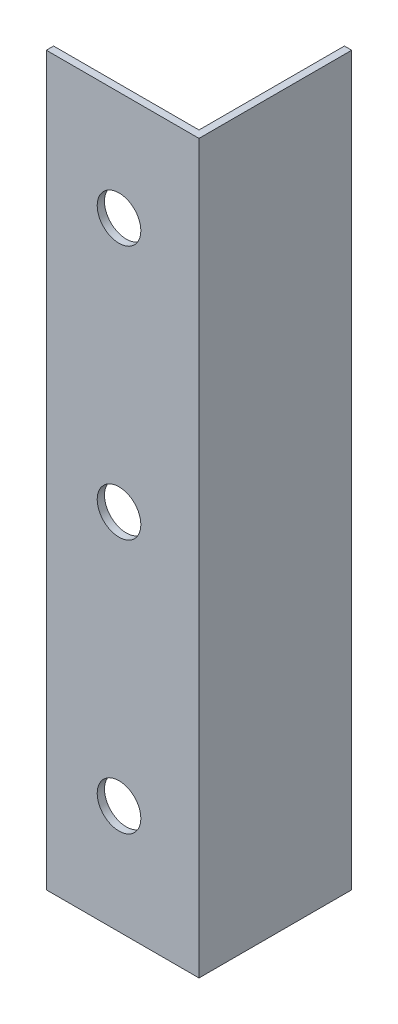
ISO-10303-21;
HEADER;
FILE_DESCRIPTION(('STEP AP214'),'2;1');
FILE_NAME('part.step','',(''),(''),'','','');
FILE_SCHEMA(('AUTOMOTIVE_DESIGN { 1 0 10303 214 1 1 1 1 }'));
ENDSEC;
DATA;
#1=APPLICATION_CONTEXT('core data for automotive mechanical design processes');
#2=APPLICATION_PROTOCOL_DEFINITION('international standard','automotive_design',2000,#1);
#3=PRODUCT_CONTEXT('',#1,'mechanical');
#4=PRODUCT('Part','Part','',(#3));
#5=PRODUCT_RELATED_PRODUCT_CATEGORY('part','',(#4));
#6=PRODUCT_DEFINITION_FORMATION('','',#4);
#7=PRODUCT_DEFINITION_CONTEXT('part definition',#1,'design');
#8=PRODUCT_DEFINITION('design','',#6,#7);
#9=PRODUCT_DEFINITION_SHAPE('','',#8);
#10=(LENGTH_UNIT() NAMED_UNIT(*) SI_UNIT(.MILLI.,.METRE.));
#11=(NAMED_UNIT(*) PLANE_ANGLE_UNIT() SI_UNIT($,.RADIAN.));
#12=(NAMED_UNIT(*) SI_UNIT($,.STERADIAN.) SOLID_ANGLE_UNIT());
#13=UNCERTAINTY_MEASURE_WITH_UNIT(LENGTH_MEASURE(1.E-05),#10,'distance_accuracy_value','');
#14=(GEOMETRIC_REPRESENTATION_CONTEXT(3) GLOBAL_UNCERTAINTY_ASSIGNED_CONTEXT((#13)) GLOBAL_UNIT_ASSIGNED_CONTEXT((#10,
#11,#12)) REPRESENTATION_CONTEXT('',''));
#15=CARTESIAN_POINT('',(0.,0.,0.));
#16=DIRECTION('',(0.,0.,1.));
#17=DIRECTION('',(1.,0.,0.));
#18=AXIS2_PLACEMENT_3D('',#15,#16,#17);
#19=CARTESIAN_POINT('',(0.,100.,0.));
#20=DIRECTION('',(-1.,0.,0.));
#21=DIRECTION('',(0.,0.,1.));
#22=AXIS2_PLACEMENT_3D('',#19,#20,#21);
#23=PLANE('',#22);
#24=DIRECTION('',(0.,0.,-1.));
#25=VECTOR('',#24,1.);
#26=CARTESIAN_POINT('',(0.,0.,0.));
#27=LINE('',#26,#25);
#28=CARTESIAN_POINT('',(0.,0.,0.));
#29=VERTEX_POINT('',#28);
#30=CARTESIAN_POINT('',(0.,0.,-0.999999999999997));
#31=VERTEX_POINT('',#30);
#32=EDGE_CURVE('E119',#29,#31,#27,.T.);
#33=ORIENTED_EDGE('',*,*,#32,.F.);
#34=DIRECTION('',(0.,-1.,0.));
#35=VECTOR('',#34,1.);
#36=CARTESIAN_POINT('',(0.,100.,0.));
#37=LINE('',#36,#35);
#38=CARTESIAN_POINT('',(0.,100.,0.));
#39=VERTEX_POINT('',#38);
#40=EDGE_CURVE('E11',#39,#29,#37,.T.);
#41=ORIENTED_EDGE('',*,*,#40,.F.);
#42=DIRECTION('',(0.,0.,-1.));
#43=VECTOR('',#42,1.);
#44=CARTESIAN_POINT('',(0.,100.,0.));
#45=LINE('',#44,#43);
#46=CARTESIAN_POINT('',(0.,100.,-0.999999999999997));
#47=VERTEX_POINT('',#46);
#48=EDGE_CURVE('E134',#39,#47,#45,.T.);
#49=ORIENTED_EDGE('',*,*,#48,.T.);
#50=DIRECTION('',(0.,-1.,0.));
#51=VECTOR('',#50,1.);
#52=CARTESIAN_POINT('',(0.,100.,-0.999999999999997));
#53=LINE('',#52,#51);
#54=EDGE_CURVE('E37',#47,#31,#53,.T.);
#55=ORIENTED_EDGE('',*,*,#54,.T.);
#56=EDGE_LOOP('',(#33,#41,#49,#55));
#57=FACE_BOUND('',#56,.T.);
#58=ADVANCED_FACE('F34',(#57),#23,.T.);
#59=CARTESIAN_POINT('',(21.,100.,0.));
#60=DIRECTION('',(0.,0.,1.));
#61=DIRECTION('',(1.,0.,0.));
#62=AXIS2_PLACEMENT_3D('',#59,#60,#61);
#63=PLANE('',#62);
#64=CARTESIAN_POINT('',(10.,15.,0.));
#65=DIRECTION('',(0.,0.,1.));
#66=DIRECTION('',(1.,0.,0.));
#67=AXIS2_PLACEMENT_3D('',#64,#65,#66);
#68=CIRCLE('',#67,3.);
#69=CARTESIAN_POINT('',(13.,15.,0.));
#70=VERTEX_POINT('',#69);
#71=EDGE_CURVE('E123',#70,#70,#68,.T.);
#72=ORIENTED_EDGE('',*,*,#71,.F.);
#73=EDGE_LOOP('',(#72));
#74=FACE_BOUND('',#73,.T.);
#75=CARTESIAN_POINT('',(10.,50.,0.));
#76=DIRECTION('',(0.,0.,1.));
#77=DIRECTION('',(1.,0.,0.));
#78=AXIS2_PLACEMENT_3D('',#75,#76,#77);
#79=CIRCLE('',#78,3.);
#80=CARTESIAN_POINT('',(13.,50.,0.));
#81=VERTEX_POINT('',#80);
#82=EDGE_CURVE('E185',#81,#81,#79,.T.);
#83=ORIENTED_EDGE('',*,*,#82,.F.);
#84=EDGE_LOOP('',(#83));
#85=FACE_BOUND('',#84,.T.);
#86=CARTESIAN_POINT('',(10.,85.,0.));
#87=DIRECTION('',(0.,0.,1.));
#88=DIRECTION('',(1.,0.,0.));
#89=AXIS2_PLACEMENT_3D('',#86,#87,#88);
#90=CIRCLE('',#89,3.);
#91=CARTESIAN_POINT('',(13.,85.,0.));
#92=VERTEX_POINT('',#91);
#93=EDGE_CURVE('E182',#92,#92,#90,.T.);
#94=ORIENTED_EDGE('',*,*,#93,.F.);
#95=EDGE_LOOP('',(#94));
#96=FACE_BOUND('',#95,.T.);
#97=DIRECTION('',(-1.,0.,0.));
#98=VECTOR('',#97,1.);
#99=CARTESIAN_POINT('',(21.,0.,0.));
#100=LINE('',#99,#98);
#101=CARTESIAN_POINT('',(21.,0.,0.));
#102=VERTEX_POINT('',#101);
#103=EDGE_CURVE('E132',#102,#29,#100,.T.);
#104=ORIENTED_EDGE('',*,*,#103,.F.);
#105=DIRECTION('',(0.,-1.,0.));
#106=VECTOR('',#105,1.);
#107=CARTESIAN_POINT('',(21.,100.,0.));
#108=LINE('',#107,#106);
#109=CARTESIAN_POINT('',(21.,100.,0.));
#110=VERTEX_POINT('',#109);
#111=EDGE_CURVE('E43',#110,#102,#108,.T.);
#112=ORIENTED_EDGE('',*,*,#111,.F.);
#113=DIRECTION('',(-1.,0.,0.));
#114=VECTOR('',#113,1.);
#115=CARTESIAN_POINT('',(21.,100.,0.));
#116=LINE('',#115,#114);
#117=EDGE_CURVE('E99',#110,#39,#116,.T.);
#118=ORIENTED_EDGE('',*,*,#117,.T.);
#119=ORIENTED_EDGE('',*,*,#40,.T.);
#120=EDGE_LOOP('',(#104,#112,#118,#119));
#121=FACE_BOUND('',#120,.T.);
#122=ADVANCED_FACE('F142',(#74,#85,#96,#121),#63,.T.);
#123=CARTESIAN_POINT('',(21.,100.,0.));
#124=DIRECTION('',(-1.,0.,0.));
#125=DIRECTION('',(0.,0.,1.));
#126=AXIS2_PLACEMENT_3D('',#123,#124,#125);
#127=PLANE('',#126);
#128=DIRECTION('',(0.,0.,-1.));
#129=VECTOR('',#128,1.);
#130=CARTESIAN_POINT('',(21.,0.,0.));
#131=LINE('',#130,#129);
#132=CARTESIAN_POINT('',(21.,0.,-21.));
#133=VERTEX_POINT('',#132);
#134=EDGE_CURVE('E104',#102,#133,#131,.T.);
#135=ORIENTED_EDGE('',*,*,#134,.T.);
#136=DIRECTION('',(0.,-1.,0.));
#137=VECTOR('',#136,1.);
#138=CARTESIAN_POINT('',(21.,100.,-21.));
#139=LINE('',#138,#137);
#140=CARTESIAN_POINT('',(21.,100.,-21.));
#141=VERTEX_POINT('',#140);
#142=EDGE_CURVE('E102',#141,#133,#139,.T.);
#143=ORIENTED_EDGE('',*,*,#142,.F.);
#144=DIRECTION('',(0.,0.,-1.));
#145=VECTOR('',#144,1.);
#146=CARTESIAN_POINT('',(21.,100.,0.));
#147=LINE('',#146,#145);
#148=EDGE_CURVE('E92',#110,#141,#147,.T.);
#149=ORIENTED_EDGE('',*,*,#148,.F.);
#150=ORIENTED_EDGE('',*,*,#111,.T.);
#151=EDGE_LOOP('',(#135,#143,#149,#150));
#152=FACE_BOUND('',#151,.T.);
#153=ADVANCED_FACE('F103',(#152),#127,.F.);
#154=CARTESIAN_POINT('',(21.,100.,-21.));
#155=DIRECTION('',(0.,0.,1.));
#156=DIRECTION('',(1.,0.,0.));
#157=AXIS2_PLACEMENT_3D('',#154,#155,#156);
#158=PLANE('',#157);
#159=DIRECTION('',(-1.,0.,0.));
#160=VECTOR('',#159,1.);
#161=CARTESIAN_POINT('',(21.,0.,-21.));
#162=LINE('',#161,#160);
#163=CARTESIAN_POINT('',(20.,0.,-21.));
#164=VERTEX_POINT('',#163);
#165=EDGE_CURVE('E129',#133,#164,#162,.T.);
#166=ORIENTED_EDGE('',*,*,#165,.T.);
#167=DIRECTION('',(0.,-1.,0.));
#168=VECTOR('',#167,1.);
#169=CARTESIAN_POINT('',(20.,100.,-21.));
#170=LINE('',#169,#168);
#171=CARTESIAN_POINT('',(20.,100.,-21.));
#172=VERTEX_POINT('',#171);
#173=EDGE_CURVE('E108',#172,#164,#170,.T.);
#174=ORIENTED_EDGE('',*,*,#173,.F.);
#175=DIRECTION('',(-1.,0.,0.));
#176=VECTOR('',#175,1.);
#177=CARTESIAN_POINT('',(21.,100.,-21.));
#178=LINE('',#177,#176);
#179=EDGE_CURVE('E97',#141,#172,#178,.T.);
#180=ORIENTED_EDGE('',*,*,#179,.F.);
#181=ORIENTED_EDGE('',*,*,#142,.T.);
#182=EDGE_LOOP('',(#166,#174,#180,#181));
#183=FACE_BOUND('',#182,.T.);
#184=ADVANCED_FACE('F110',(#183),#158,.F.);
#185=CARTESIAN_POINT('',(20.,100.,-0.999999999999997));
#186=DIRECTION('',(-1.,0.,0.));
#187=DIRECTION('',(0.,0.,1.));
#188=AXIS2_PLACEMENT_3D('',#185,#186,#187);
#189=PLANE('',#188);
#190=DIRECTION('',(0.,0.,-1.));
#191=VECTOR('',#190,1.);
#192=CARTESIAN_POINT('',(20.,0.,-0.999999999999997));
#193=LINE('',#192,#191);
#194=CARTESIAN_POINT('',(20.,0.,-0.999999999999997));
#195=VERTEX_POINT('',#194);
#196=EDGE_CURVE('E126',#195,#164,#193,.T.);
#197=ORIENTED_EDGE('',*,*,#196,.F.);
#198=DIRECTION('',(0.,-1.,0.));
#199=VECTOR('',#198,1.);
#200=CARTESIAN_POINT('',(20.,100.,-0.999999999999997));
#201=LINE('',#200,#199);
#202=CARTESIAN_POINT('',(20.,100.,-0.999999999999997));
#203=VERTEX_POINT('',#202);
#204=EDGE_CURVE('E137',#203,#195,#201,.T.);
#205=ORIENTED_EDGE('',*,*,#204,.F.);
#206=DIRECTION('',(0.,0.,-1.));
#207=VECTOR('',#206,1.);
#208=CARTESIAN_POINT('',(20.,100.,-0.999999999999997));
#209=LINE('',#208,#207);
#210=EDGE_CURVE('E112',#203,#172,#209,.T.);
#211=ORIENTED_EDGE('',*,*,#210,.T.);
#212=ORIENTED_EDGE('',*,*,#173,.T.);
#213=EDGE_LOOP('',(#197,#205,#211,#212));
#214=FACE_BOUND('',#213,.T.);
#215=ADVANCED_FACE('F158',(#214),#189,.T.);
#216=CARTESIAN_POINT('',(0.,100.,-0.999999999999997));
#217=DIRECTION('',(0.,0.,-1.));
#218=DIRECTION('',(-1.,0.,0.));
#219=AXIS2_PLACEMENT_3D('',#216,#217,#218);
#220=PLANE('',#219);
#221=CARTESIAN_POINT('',(10.,15.,-0.999999999999997));
#222=DIRECTION('',(0.,0.,-1.));
#223=DIRECTION('',(-1.,0.,0.));
#224=AXIS2_PLACEMENT_3D('',#221,#222,#223);
#225=CIRCLE('',#224,3.);
#226=CARTESIAN_POINT('',(7.,15.,-0.999999999999997));
#227=VERTEX_POINT('',#226);
#228=EDGE_CURVE('E169',#227,#227,#225,.T.);
#229=ORIENTED_EDGE('',*,*,#228,.F.);
#230=EDGE_LOOP('',(#229));
#231=FACE_BOUND('',#230,.T.);
#232=CARTESIAN_POINT('',(10.,50.,-0.999999999999997));
#233=DIRECTION('',(0.,0.,-1.));
#234=DIRECTION('',(-1.,0.,0.));
#235=AXIS2_PLACEMENT_3D('',#232,#233,#234);
#236=CIRCLE('',#235,3.);
#237=CARTESIAN_POINT('',(7.,50.,-0.999999999999997));
#238=VERTEX_POINT('',#237);
#239=EDGE_CURVE('E173',#238,#238,#236,.T.);
#240=ORIENTED_EDGE('',*,*,#239,.F.);
#241=EDGE_LOOP('',(#240));
#242=FACE_BOUND('',#241,.T.);
#243=CARTESIAN_POINT('',(10.,85.,-0.999999999999997));
#244=DIRECTION('',(0.,0.,-1.));
#245=DIRECTION('',(-1.,0.,0.));
#246=AXIS2_PLACEMENT_3D('',#243,#244,#245);
#247=CIRCLE('',#246,3.);
#248=CARTESIAN_POINT('',(7.,85.,-0.999999999999997));
#249=VERTEX_POINT('',#248);
#250=EDGE_CURVE('E176',#249,#249,#247,.T.);
#251=ORIENTED_EDGE('',*,*,#250,.F.);
#252=EDGE_LOOP('',(#251));
#253=FACE_BOUND('',#252,.T.);
#254=DIRECTION('',(1.,0.,0.));
#255=VECTOR('',#254,1.);
#256=CARTESIAN_POINT('',(0.,0.,-0.999999999999997));
#257=LINE('',#256,#255);
#258=EDGE_CURVE('E122',#31,#195,#257,.T.);
#259=ORIENTED_EDGE('',*,*,#258,.F.);
#260=ORIENTED_EDGE('',*,*,#54,.F.);
#261=DIRECTION('',(1.,0.,0.));
#262=VECTOR('',#261,1.);
#263=CARTESIAN_POINT('',(0.,100.,-0.999999999999997));
#264=LINE('',#263,#262);
#265=EDGE_CURVE('E114',#47,#203,#264,.T.);
#266=ORIENTED_EDGE('',*,*,#265,.T.);
#267=ORIENTED_EDGE('',*,*,#204,.T.);
#268=EDGE_LOOP('',(#259,#260,#266,#267));
#269=FACE_BOUND('',#268,.T.);
#270=ADVANCED_FACE('F139',(#231,#242,#253,#269),#220,.T.);
#271=CARTESIAN_POINT('',(0.,100.,0.));
#272=DIRECTION('',(0.,-1.,0.));
#273=DIRECTION('',(0.,0.,-1.));
#274=AXIS2_PLACEMENT_3D('',#271,#272,#273);
#275=PLANE('',#274);
#276=ORIENTED_EDGE('',*,*,#48,.F.);
#277=ORIENTED_EDGE('',*,*,#117,.F.);
#278=ORIENTED_EDGE('',*,*,#148,.T.);
#279=ORIENTED_EDGE('',*,*,#179,.T.);
#280=ORIENTED_EDGE('',*,*,#210,.F.);
#281=ORIENTED_EDGE('',*,*,#265,.F.);
#282=EDGE_LOOP('',(#276,#277,#278,#279,#280,#281));
#283=FACE_BOUND('',#282,.T.);
#284=ADVANCED_FACE('F94',(#283),#275,.F.);
#285=CARTESIAN_POINT('',(0.,0.,0.));
#286=DIRECTION('',(0.,-1.,0.));
#287=DIRECTION('',(0.,0.,-1.));
#288=AXIS2_PLACEMENT_3D('',#285,#286,#287);
#289=PLANE('',#288);
#290=ORIENTED_EDGE('',*,*,#32,.T.);
#291=ORIENTED_EDGE('',*,*,#258,.T.);
#292=ORIENTED_EDGE('',*,*,#196,.T.);
#293=ORIENTED_EDGE('',*,*,#165,.F.);
#294=ORIENTED_EDGE('',*,*,#134,.F.);
#295=ORIENTED_EDGE('',*,*,#103,.T.);
#296=EDGE_LOOP('',(#290,#291,#292,#293,#294,#295));
#297=FACE_BOUND('',#296,.T.);
#298=ADVANCED_FACE('F141',(#297),#289,.T.);
#299=CARTESIAN_POINT('',(10.,85.,9.));
#300=DIRECTION('',(0.,0.,-1.));
#301=DIRECTION('',(-1.,0.,0.));
#302=AXIS2_PLACEMENT_3D('',#299,#300,#301);
#303=CYLINDRICAL_SURFACE('',#302,3.);
#304=ORIENTED_EDGE('',*,*,#93,.T.);
#305=EDGE_LOOP('',(#304));
#306=FACE_BOUND('',#305,.T.);
#307=ORIENTED_EDGE('',*,*,#250,.T.);
#308=EDGE_LOOP('',(#307));
#309=FACE_BOUND('',#308,.T.);
#310=ADVANCED_FACE('F199',(#306,#309),#303,.F.);
#311=CARTESIAN_POINT('',(10.,50.,9.));
#312=DIRECTION('',(0.,0.,-1.));
#313=DIRECTION('',(-1.,0.,0.));
#314=AXIS2_PLACEMENT_3D('',#311,#312,#313);
#315=CYLINDRICAL_SURFACE('',#314,3.);
#316=ORIENTED_EDGE('',*,*,#82,.T.);
#317=EDGE_LOOP('',(#316));
#318=FACE_BOUND('',#317,.T.);
#319=ORIENTED_EDGE('',*,*,#239,.T.);
#320=EDGE_LOOP('',(#319));
#321=FACE_BOUND('',#320,.T.);
#322=ADVANCED_FACE('F194',(#318,#321),#315,.F.);
#323=CARTESIAN_POINT('',(10.,15.,9.));
#324=DIRECTION('',(0.,0.,-1.));
#325=DIRECTION('',(-1.,0.,0.));
#326=AXIS2_PLACEMENT_3D('',#323,#324,#325);
#327=CYLINDRICAL_SURFACE('',#326,3.);
#328=ORIENTED_EDGE('',*,*,#71,.T.);
#329=EDGE_LOOP('',(#328));
#330=FACE_BOUND('',#329,.T.);
#331=ORIENTED_EDGE('',*,*,#228,.T.);
#332=EDGE_LOOP('',(#331));
#333=FACE_BOUND('',#332,.T.);
#334=ADVANCED_FACE('F191',(#330,#333),#327,.F.);
#335=CLOSED_SHELL('',(#58,#122,#153,#184,#215,#270,#284,#298,#310,#322,#334));
#336=MANIFOLD_SOLID_BREP('B2',#335);
#337=ADVANCED_BREP_SHAPE_REPRESENTATION('',(#18,#336),#14);
#338=SHAPE_DEFINITION_REPRESENTATION(#9,#337);
ENDSEC;
END-ISO-10303-21;
